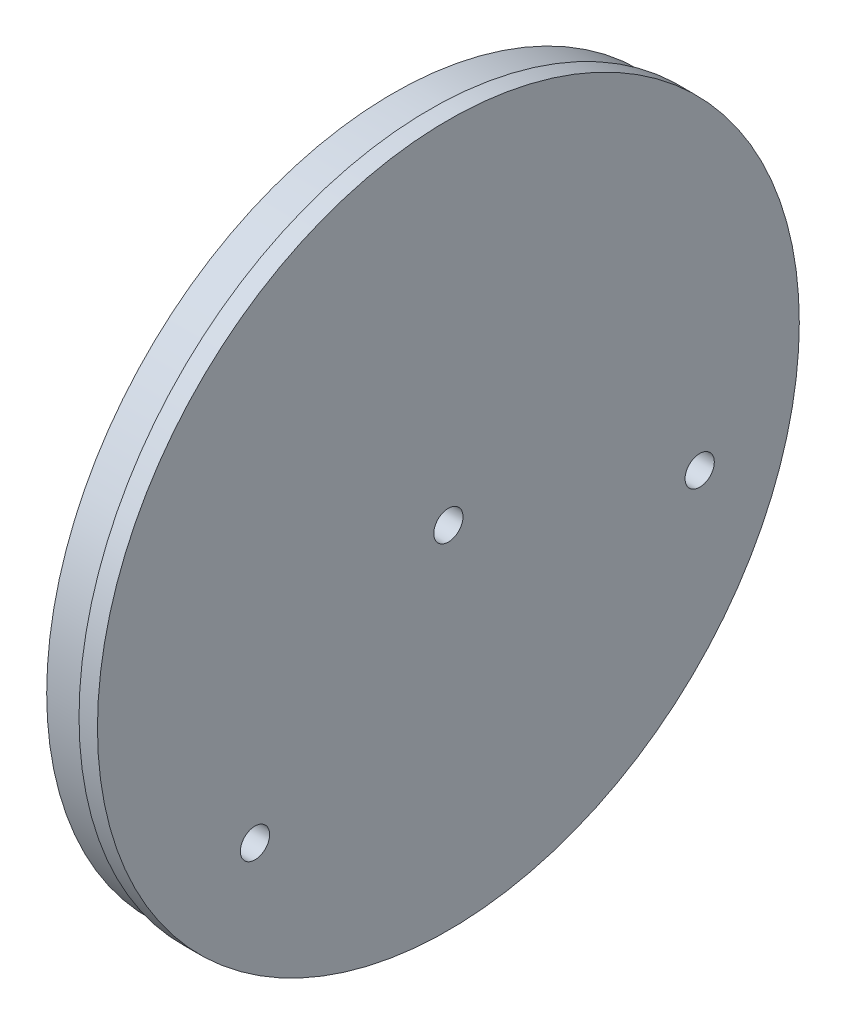
ISO-10303-21;
HEADER;
FILE_DESCRIPTION(('STEP AP214'),'2;1');
FILE_NAME('part.step','',(''),(''),'','','');
FILE_SCHEMA(('AUTOMOTIVE_DESIGN { 1 0 10303 214 1 1 1 1 }'));
ENDSEC;
DATA;
#1=APPLICATION_CONTEXT('core data for automotive mechanical design processes');
#2=APPLICATION_PROTOCOL_DEFINITION('international standard','automotive_design',2000,#1);
#3=PRODUCT_CONTEXT('',#1,'mechanical');
#4=PRODUCT('Part','Part','',(#3));
#5=PRODUCT_RELATED_PRODUCT_CATEGORY('part','',(#4));
#6=PRODUCT_DEFINITION_FORMATION('','',#4);
#7=PRODUCT_DEFINITION_CONTEXT('part definition',#1,'design');
#8=PRODUCT_DEFINITION('design','',#6,#7);
#9=PRODUCT_DEFINITION_SHAPE('','',#8);
#10=(LENGTH_UNIT() NAMED_UNIT(*) SI_UNIT(.MILLI.,.METRE.));
#11=(NAMED_UNIT(*) PLANE_ANGLE_UNIT() SI_UNIT($,.RADIAN.));
#12=(NAMED_UNIT(*) SI_UNIT($,.STERADIAN.) SOLID_ANGLE_UNIT());
#13=UNCERTAINTY_MEASURE_WITH_UNIT(LENGTH_MEASURE(1.E-05),#10,'distance_accuracy_value','');
#14=(GEOMETRIC_REPRESENTATION_CONTEXT(3) GLOBAL_UNCERTAINTY_ASSIGNED_CONTEXT((#13)) GLOBAL_UNIT_ASSIGNED_CONTEXT((#10,
#11,#12)) REPRESENTATION_CONTEXT('',''));
#15=CARTESIAN_POINT('',(0.,0.,0.));
#16=DIRECTION('',(0.,0.,1.));
#17=DIRECTION('',(1.,0.,0.));
#18=AXIS2_PLACEMENT_3D('',#15,#16,#17);
#19=CARTESIAN_POINT('',(12.,0.,0.));
#20=DIRECTION('',(-1.,0.,0.));
#21=DIRECTION('',(0.,0.,1.));
#22=AXIS2_PLACEMENT_3D('',#19,#20,#21);
#23=CYLINDRICAL_SURFACE('',#22,76.2);
#24=CARTESIAN_POINT('',(12.,0.,0.));
#25=DIRECTION('',(1.,0.,0.));
#26=DIRECTION('',(0.,0.,-1.));
#27=AXIS2_PLACEMENT_3D('',#24,#25,#26);
#28=CIRCLE('',#27,76.2);
#29=CARTESIAN_POINT('',(12.,0.,-76.2));
#30=VERTEX_POINT('',#29);
#31=EDGE_CURVE('E11',#30,#30,#28,.T.);
#32=ORIENTED_EDGE('',*,*,#31,.F.);
#33=EDGE_LOOP('',(#32));
#34=FACE_BOUND('',#33,.T.);
#35=CARTESIAN_POINT('',(8.,0.,0.));
#36=DIRECTION('',(-1.,0.,0.));
#37=DIRECTION('',(0.,0.,1.));
#38=AXIS2_PLACEMENT_3D('',#35,#36,#37);
#39=CIRCLE('',#38,76.2);
#40=CARTESIAN_POINT('',(8.,0.,76.2));
#41=VERTEX_POINT('',#40);
#42=EDGE_CURVE('E47',#41,#41,#39,.T.);
#43=ORIENTED_EDGE('',*,*,#42,.F.);
#44=EDGE_LOOP('',(#43));
#45=FACE_BOUND('',#44,.T.);
#46=ADVANCED_FACE('F44',(#34,#45),#23,.T.);
#47=CARTESIAN_POINT('',(12.,0.,0.));
#48=DIRECTION('',(1.,0.,0.));
#49=DIRECTION('',(0.,0.,-1.));
#50=AXIS2_PLACEMENT_3D('',#47,#48,#49);
#51=PLANE('',#50);
#52=CARTESIAN_POINT('',(12.,-16.9860314725136,-54.567364191564));
#53=DIRECTION('',(1.,0.,0.));
#54=DIRECTION('',(0.,0.866025403784436,0.500000000000004));
#55=AXIS2_PLACEMENT_3D('',#52,#53,#54);
#56=CIRCLE('',#55,3.175);
#57=CARTESIAN_POINT('',(12.,-14.2364008154981,-52.979864191564));
#58=VERTEX_POINT('',#57);
#59=EDGE_CURVE('E82',#58,#58,#56,.T.);
#60=ORIENTED_EDGE('',*,*,#59,.F.);
#61=EDGE_LOOP('',(#60));
#62=FACE_BOUND('',#61,.T.);
#63=CARTESIAN_POINT('',(12.,-38.7637078711947,41.994016860461));
#64=DIRECTION('',(1.,0.,0.));
#65=DIRECTION('',(0.,0.,-1.));
#66=AXIS2_PLACEMENT_3D('',#63,#64,#65);
#67=CIRCLE('',#66,3.175);
#68=CARTESIAN_POINT('',(12.,-38.7637078711947,38.819016860461));
#69=VERTEX_POINT('',#68);
#70=EDGE_CURVE('E74',#69,#69,#67,.T.);
#71=ORIENTED_EDGE('',*,*,#70,.F.);
#72=EDGE_LOOP('',(#71));
#73=FACE_BOUND('',#72,.T.);
#74=CARTESIAN_POINT('',(12.,0.,0.));
#75=DIRECTION('',(1.,0.,0.));
#76=DIRECTION('',(0.,0.,-1.));
#77=AXIS2_PLACEMENT_3D('',#74,#75,#76);
#78=CIRCLE('',#77,3.175);
#79=CARTESIAN_POINT('',(12.,0.,-3.175));
#80=VERTEX_POINT('',#79);
#81=EDGE_CURVE('E66',#80,#80,#78,.T.);
#82=ORIENTED_EDGE('',*,*,#81,.F.);
#83=EDGE_LOOP('',(#82));
#84=FACE_BOUND('',#83,.T.);
#85=ORIENTED_EDGE('',*,*,#31,.T.);
#86=EDGE_LOOP('',(#85));
#87=FACE_BOUND('',#86,.T.);
#88=ADVANCED_FACE('F100',(#62,#73,#84,#87),#51,.T.);
#89=CARTESIAN_POINT('',(8.,0.,0.));
#90=DIRECTION('',(-1.,0.,0.));
#91=DIRECTION('',(0.,0.,1.));
#92=AXIS2_PLACEMENT_3D('',#89,#90,#91);
#93=PLANE('',#92);
#94=CARTESIAN_POINT('',(8.,0.,0.));
#95=DIRECTION('',(-1.,0.,0.));
#96=DIRECTION('',(0.,0.,1.));
#97=AXIS2_PLACEMENT_3D('',#94,#95,#96);
#98=CIRCLE('',#97,75.2221);
#99=CARTESIAN_POINT('',(8.,0.,75.2221));
#100=VERTEX_POINT('',#99);
#101=EDGE_CURVE('E56',#100,#100,#98,.T.);
#102=ORIENTED_EDGE('',*,*,#101,.F.);
#103=EDGE_LOOP('',(#102));
#104=FACE_BOUND('',#103,.T.);
#105=ORIENTED_EDGE('',*,*,#42,.T.);
#106=EDGE_LOOP('',(#105));
#107=FACE_BOUND('',#106,.T.);
#108=ADVANCED_FACE('F103',(#104,#107),#93,.T.);
#109=CARTESIAN_POINT('',(8.,0.,0.));
#110=DIRECTION('',(-1.,0.,0.));
#111=DIRECTION('',(0.,0.,1.));
#112=AXIS2_PLACEMENT_3D('',#109,#110,#111);
#113=CYLINDRICAL_SURFACE('',#112,75.2221);
#114=ORIENTED_EDGE('',*,*,#101,.T.);
#115=EDGE_LOOP('',(#114));
#116=FACE_BOUND('',#115,.T.);
#117=CARTESIAN_POINT('',(0.,0.,0.));
#118=DIRECTION('',(-1.,0.,0.));
#119=DIRECTION('',(0.,0.,1.));
#120=AXIS2_PLACEMENT_3D('',#117,#118,#119);
#121=CIRCLE('',#120,75.2221);
#122=CARTESIAN_POINT('',(0.,0.,75.2221));
#123=VERTEX_POINT('',#122);
#124=EDGE_CURVE('E58',#123,#123,#121,.T.);
#125=ORIENTED_EDGE('',*,*,#124,.F.);
#126=EDGE_LOOP('',(#125));
#127=FACE_BOUND('',#126,.T.);
#128=ADVANCED_FACE('F120',(#116,#127),#113,.T.);
#129=CARTESIAN_POINT('',(0.,0.,0.));
#130=DIRECTION('',(1.,0.,0.));
#131=DIRECTION('',(0.,0.,-1.));
#132=AXIS2_PLACEMENT_3D('',#129,#130,#131);
#133=PLANE('',#132);
#134=CARTESIAN_POINT('',(0.,-16.9860314725136,-54.567364191564));
#135=DIRECTION('',(1.,0.,0.));
#136=DIRECTION('',(0.,0.866025403784436,0.500000000000004));
#137=AXIS2_PLACEMENT_3D('',#134,#135,#136);
#138=CIRCLE('',#137,3.175);
#139=CARTESIAN_POINT('',(0.,-14.2364008154981,-52.979864191564));
#140=VERTEX_POINT('',#139);
#141=EDGE_CURVE('E78',#140,#140,#138,.T.);
#142=ORIENTED_EDGE('',*,*,#141,.T.);
#143=EDGE_LOOP('',(#142));
#144=FACE_BOUND('',#143,.T.);
#145=CARTESIAN_POINT('',(0.,-38.7637078711947,41.994016860461));
#146=DIRECTION('',(1.,0.,0.));
#147=DIRECTION('',(0.,0.,-1.));
#148=AXIS2_PLACEMENT_3D('',#145,#146,#147);
#149=CIRCLE('',#148,3.175);
#150=CARTESIAN_POINT('',(0.,-38.7637078711947,38.819016860461));
#151=VERTEX_POINT('',#150);
#152=EDGE_CURVE('E70',#151,#151,#149,.T.);
#153=ORIENTED_EDGE('',*,*,#152,.T.);
#154=EDGE_LOOP('',(#153));
#155=FACE_BOUND('',#154,.T.);
#156=CARTESIAN_POINT('',(0.,0.,0.));
#157=DIRECTION('',(1.,0.,0.));
#158=DIRECTION('',(0.,0.,-1.));
#159=AXIS2_PLACEMENT_3D('',#156,#157,#158);
#160=CIRCLE('',#159,3.175);
#161=CARTESIAN_POINT('',(0.,0.,-3.175));
#162=VERTEX_POINT('',#161);
#163=EDGE_CURVE('E62',#162,#162,#160,.T.);
#164=ORIENTED_EDGE('',*,*,#163,.T.);
#165=EDGE_LOOP('',(#164));
#166=FACE_BOUND('',#165,.T.);
#167=ORIENTED_EDGE('',*,*,#124,.T.);
#168=EDGE_LOOP('',(#167));
#169=FACE_BOUND('',#168,.T.);
#170=ADVANCED_FACE('F90',(#144,#155,#166,#169),#133,.F.);
#171=CARTESIAN_POINT('',(0.,0.,0.));
#172=DIRECTION('',(1.,0.,0.));
#173=DIRECTION('',(0.,0.,-1.));
#174=AXIS2_PLACEMENT_3D('',#171,#172,#173);
#175=CYLINDRICAL_SURFACE('',#174,3.175);
#176=ORIENTED_EDGE('',*,*,#163,.F.);
#177=EDGE_LOOP('',(#176));
#178=FACE_BOUND('',#177,.T.);
#179=ORIENTED_EDGE('',*,*,#81,.T.);
#180=EDGE_LOOP('',(#179));
#181=FACE_BOUND('',#180,.T.);
#182=ADVANCED_FACE('F109',(#178,#181),#175,.F.);
#183=CARTESIAN_POINT('',(0.,-38.7637078711947,41.994016860461));
#184=DIRECTION('',(1.,0.,0.));
#185=DIRECTION('',(0.,0.,-1.));
#186=AXIS2_PLACEMENT_3D('',#183,#184,#185);
#187=CYLINDRICAL_SURFACE('',#186,3.175);
#188=ORIENTED_EDGE('',*,*,#152,.F.);
#189=EDGE_LOOP('',(#188));
#190=FACE_BOUND('',#189,.T.);
#191=ORIENTED_EDGE('',*,*,#70,.T.);
#192=EDGE_LOOP('',(#191));
#193=FACE_BOUND('',#192,.T.);
#194=ADVANCED_FACE('F96',(#190,#193),#187,.F.);
#195=CARTESIAN_POINT('',(0.,-16.9860314725136,-54.567364191564));
#196=DIRECTION('',(1.,0.,0.));
#197=DIRECTION('',(0.,0.,-1.));
#198=AXIS2_PLACEMENT_3D('',#195,#196,#197);
#199=CYLINDRICAL_SURFACE('',#198,3.175);
#200=ORIENTED_EDGE('',*,*,#141,.F.);
#201=EDGE_LOOP('',(#200));
#202=FACE_BOUND('',#201,.T.);
#203=ORIENTED_EDGE('',*,*,#59,.T.);
#204=EDGE_LOOP('',(#203));
#205=FACE_BOUND('',#204,.T.);
#206=ADVANCED_FACE('F93',(#202,#205),#199,.F.);
#207=CLOSED_SHELL('',(#46,#88,#108,#128,#170,#182,#194,#206));
#208=MANIFOLD_SOLID_BREP('B2',#207);
#209=ADVANCED_BREP_SHAPE_REPRESENTATION('',(#18,#208),#14);
#210=SHAPE_DEFINITION_REPRESENTATION(#9,#209);
ENDSEC;
END-ISO-10303-21;
